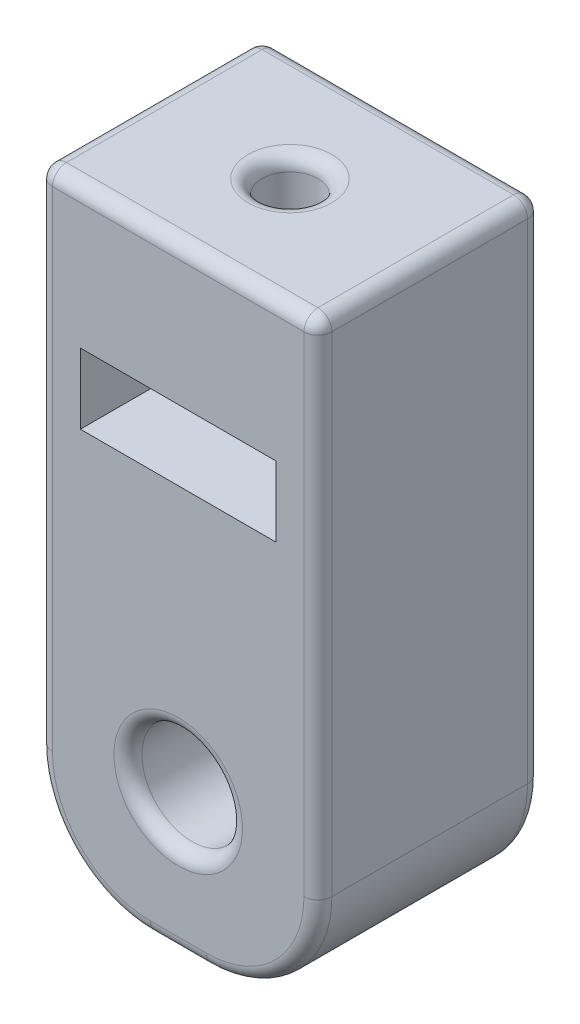
ISO-10303-21;
HEADER;
FILE_DESCRIPTION(('STEP AP214'),'2;1');
FILE_NAME('part.step','',(''),(''),'','','');
FILE_SCHEMA(('AUTOMOTIVE_DESIGN { 1 0 10303 214 1 1 1 1 }'));
ENDSEC;
DATA;
#1=APPLICATION_CONTEXT('core data for automotive mechanical design processes');
#2=APPLICATION_PROTOCOL_DEFINITION('international standard','automotive_design',2000,#1);
#3=PRODUCT_CONTEXT('',#1,'mechanical');
#4=PRODUCT('Part','Part','',(#3));
#5=PRODUCT_RELATED_PRODUCT_CATEGORY('part','',(#4));
#6=PRODUCT_DEFINITION_FORMATION('','',#4);
#7=PRODUCT_DEFINITION_CONTEXT('part definition',#1,'design');
#8=PRODUCT_DEFINITION('design','',#6,#7);
#9=PRODUCT_DEFINITION_SHAPE('','',#8);
#10=(LENGTH_UNIT() NAMED_UNIT(*) SI_UNIT(.MILLI.,.METRE.));
#11=(NAMED_UNIT(*) PLANE_ANGLE_UNIT() SI_UNIT($,.RADIAN.));
#12=(NAMED_UNIT(*) SI_UNIT($,.STERADIAN.) SOLID_ANGLE_UNIT());
#13=UNCERTAINTY_MEASURE_WITH_UNIT(LENGTH_MEASURE(1.E-05),#10,'distance_accuracy_value','');
#14=(GEOMETRIC_REPRESENTATION_CONTEXT(3) GLOBAL_UNCERTAINTY_ASSIGNED_CONTEXT((#13)) GLOBAL_UNIT_ASSIGNED_CONTEXT((#10,
#11,#12)) REPRESENTATION_CONTEXT('',''));
#15=CARTESIAN_POINT('',(0.,0.,0.));
#16=DIRECTION('',(0.,0.,1.));
#17=DIRECTION('',(1.,0.,0.));
#18=AXIS2_PLACEMENT_3D('',#15,#16,#17);
#19=CARTESIAN_POINT('',(6.35,12.7,5.08));
#20=DIRECTION('',(0.,1.,0.));
#21=DIRECTION('',(0.,0.,1.));
#22=AXIS2_PLACEMENT_3D('',#19,#20,#21);
#23=CYLINDRICAL_SURFACE('',#22,1.27);
#24=CARTESIAN_POINT('',(6.35,21.59,5.08));
#25=DIRECTION('',(0.,1.,0.));
#26=DIRECTION('',(0.,0.,1.));
#27=AXIS2_PLACEMENT_3D('',#24,#25,#26);
#28=CIRCLE('',#27,1.27);
#29=CARTESIAN_POINT('',(6.35,21.59,6.35));
#30=VERTEX_POINT('',#29);
#31=EDGE_CURVE('E43',#30,#30,#28,.F.);
#32=CARTESIAN_POINT('',(6.35,27.305,5.08));
#33=DIRECTION('',(0.,-1.,0.));
#34=DIRECTION('',(0.,0.,-1.));
#35=AXIS2_PLACEMENT_3D('',#32,#33,#34);
#36=CIRCLE('',#35,1.27);
#37=CARTESIAN_POINT('',(6.35,27.305,6.35));
#38=VERTEX_POINT('',#37);
#39=EDGE_CURVE('E279',#38,#38,#36,.F.);
#40=CARTESIAN_POINT('',(6.35,21.59,6.35));
#41=CARTESIAN_POINT('',(6.35,21.64953125,6.35));
#42=CARTESIAN_POINT('',(6.35,21.7090625,6.35));
#43=CARTESIAN_POINT('',(6.35,21.828125,6.35));
#44=CARTESIAN_POINT('',(6.35,21.88765625,6.35));
#45=CARTESIAN_POINT('',(6.35,22.00671875,6.35));
#46=CARTESIAN_POINT('',(6.35,22.06625,6.35));
#47=CARTESIAN_POINT('',(6.35,22.1853125,6.35));
#48=CARTESIAN_POINT('',(6.35,22.24484375,6.35));
#49=CARTESIAN_POINT('',(6.35,22.36390625,6.35));
#50=CARTESIAN_POINT('',(6.35,22.4234375,6.35));
#51=CARTESIAN_POINT('',(6.35,22.5425,6.35));
#52=CARTESIAN_POINT('',(6.35,22.60203125,6.35));
#53=CARTESIAN_POINT('',(6.35,22.72109375,6.35));
#54=CARTESIAN_POINT('',(6.35,22.780625,6.35));
#55=CARTESIAN_POINT('',(6.35,22.8996875,6.35));
#56=CARTESIAN_POINT('',(6.35,22.95921875,6.35));
#57=CARTESIAN_POINT('',(6.35,23.07828125,6.35));
#58=CARTESIAN_POINT('',(6.35,23.1378125,6.35));
#59=CARTESIAN_POINT('',(6.35,23.256875,6.35));
#60=CARTESIAN_POINT('',(6.35,23.31640625,6.35));
#61=CARTESIAN_POINT('',(6.35,23.43546875,6.35));
#62=CARTESIAN_POINT('',(6.35,23.495,6.35));
#63=CARTESIAN_POINT('',(6.35,23.6140625,6.35));
#64=CARTESIAN_POINT('',(6.35,23.67359375,6.35));
#65=CARTESIAN_POINT('',(6.35,23.79265625,6.35));
#66=CARTESIAN_POINT('',(6.35,23.8521875,6.35));
#67=CARTESIAN_POINT('',(6.35,23.97125,6.35));
#68=CARTESIAN_POINT('',(6.35,24.03078125,6.35));
#69=CARTESIAN_POINT('',(6.35,24.14984375,6.35));
#70=CARTESIAN_POINT('',(6.35,24.209375,6.35));
#71=CARTESIAN_POINT('',(6.35,24.3284375,6.35));
#72=CARTESIAN_POINT('',(6.35,24.38796875,6.35));
#73=CARTESIAN_POINT('',(6.35,24.50703125,6.35));
#74=CARTESIAN_POINT('',(6.35,24.5665625,6.35));
#75=CARTESIAN_POINT('',(6.35,24.685625,6.35));
#76=CARTESIAN_POINT('',(6.35,24.74515625,6.35));
#77=CARTESIAN_POINT('',(6.35,24.86421875,6.35));
#78=CARTESIAN_POINT('',(6.35,24.92375,6.35));
#79=CARTESIAN_POINT('',(6.35,25.0428125,6.35));
#80=CARTESIAN_POINT('',(6.35,25.10234375,6.35));
#81=CARTESIAN_POINT('',(6.35,25.22140625,6.35));
#82=CARTESIAN_POINT('',(6.35,25.2809375,6.35));
#83=CARTESIAN_POINT('',(6.35,25.4,6.35));
#84=CARTESIAN_POINT('',(6.35,25.45953125,6.35));
#85=CARTESIAN_POINT('',(6.35,25.57859375,6.35));
#86=CARTESIAN_POINT('',(6.35,25.638125,6.35));
#87=CARTESIAN_POINT('',(6.35,25.7571875,6.35));
#88=CARTESIAN_POINT('',(6.35,25.81671875,6.35));
#89=CARTESIAN_POINT('',(6.35,25.93578125,6.35));
#90=CARTESIAN_POINT('',(6.35,25.9953125,6.35));
#91=CARTESIAN_POINT('',(6.35,26.114375,6.35));
#92=CARTESIAN_POINT('',(6.35,26.17390625,6.35));
#93=CARTESIAN_POINT('',(6.35,26.29296875,6.35));
#94=CARTESIAN_POINT('',(6.35,26.3525,6.35));
#95=CARTESIAN_POINT('',(6.35,26.4715625,6.35));
#96=CARTESIAN_POINT('',(6.35,26.53109375,6.35));
#97=CARTESIAN_POINT('',(6.35,26.65015625,6.35));
#98=CARTESIAN_POINT('',(6.35,26.7096875,6.35));
#99=CARTESIAN_POINT('',(6.35,26.82875,6.35));
#100=CARTESIAN_POINT('',(6.35,26.88828125,6.35));
#101=CARTESIAN_POINT('',(6.35,27.00734375,6.35));
#102=CARTESIAN_POINT('',(6.35,27.066875,6.35));
#103=CARTESIAN_POINT('',(6.35,27.1859375,6.35));
#104=CARTESIAN_POINT('',(6.35,27.24546875,6.35));
#105=CARTESIAN_POINT('',(6.35,27.305,6.35));
#106=B_SPLINE_CURVE_WITH_KNOTS('',3,(#40,#41,#42,#43,#44,#45,#46,#47,#48,#49,#50,#51,#52,#53,
#54,#55,#56,#57,#58,#59,#60,#61,#62,#63,#64,#65,#66,#67,#68,#69,#70,#71,#72,#73,#74,#75,#76,#77,
#78,#79,#80,#81,#82,#83,#84,#85,#86,#87,#88,#89,#90,#91,#92,#93,#94,#95,#96,#97,#98,#99,#100,
#101,#102,#103,#104,#105),.UNSPECIFIED.,.F.,.F.,(4,2,2,2,2,2,2,2,2,2,2,2,2,2,2,2,2,2,2,2,2,2,2,
2,2,2,2,2,2,2,2,2,4),(0.,0.178593750000001,0.357187499999998,0.535781250000002,0.714375,
0.892968750000001,1.0715625,1.25015625,1.42875,1.60734375,1.7859375,1.96453125,2.143125,
2.32171875,2.5003125,2.67890625,2.8575,3.03609375,3.2146875,3.39328125,3.571875,3.75046875,
3.9290625,4.10765625,4.28625,4.46484375,4.6434375,4.82203125,5.000625,5.17921875,
5.35781250000001,5.53640625,5.71500000000001),.UNSPECIFIED.);
#107=EDGE_CURVE('BSEAM39',#30,#38,#106,.T.);
#108=ORIENTED_EDGE('',*,*,#31,.T.);
#109=ORIENTED_EDGE('',*,*,#39,.T.);
#110=ORIENTED_EDGE('',*,*,#107,.T.);
#111=ORIENTED_EDGE('',*,*,#107,.F.);
#112=EDGE_LOOP('',(#108,#110,#109,#111));
#113=FACE_BOUND('',#112,.T.);
#114=ADVANCED_FACE('F39',(#113),#23,.F.);
#115=CARTESIAN_POINT('',(0.,0.,10.16));
#116=DIRECTION('',(0.,0.,-1.));
#117=DIRECTION('',(-1.,0.,0.));
#118=AXIS2_PLACEMENT_3D('',#115,#116,#117);
#119=PLANE('',#118);
#120=DIRECTION('',(1.,0.,0.));
#121=VECTOR('',#120,1.);
#122=CARTESIAN_POINT('',(10.795,21.59,10.16));
#123=LINE('',#122,#121);
#124=CARTESIAN_POINT('',(1.905,21.59,10.16));
#125=VERTEX_POINT('',#124);
#126=CARTESIAN_POINT('',(10.795,21.59,10.16));
#127=VERTEX_POINT('',#126);
#128=EDGE_CURVE('E174',#125,#127,#123,.T.);
#129=ORIENTED_EDGE('',*,*,#128,.T.);
#130=DIRECTION('',(0.,-1.,0.));
#131=VECTOR('',#130,1.);
#132=CARTESIAN_POINT('',(10.795,21.59,10.16));
#133=LINE('',#132,#131);
#134=CARTESIAN_POINT('',(10.795,18.39468,10.16));
#135=VERTEX_POINT('',#134);
#136=EDGE_CURVE('E168',#127,#135,#133,.T.);
#137=ORIENTED_EDGE('',*,*,#136,.T.);
#138=DIRECTION('',(-1.,0.,0.));
#139=VECTOR('',#138,1.);
#140=CARTESIAN_POINT('',(10.795,18.39468,10.16));
#141=LINE('',#140,#139);
#142=CARTESIAN_POINT('',(1.905,18.39468,10.16));
#143=VERTEX_POINT('',#142);
#144=EDGE_CURVE('E177',#135,#143,#141,.T.);
#145=ORIENTED_EDGE('',*,*,#144,.T.);
#146=DIRECTION('',(0.,1.,0.));
#147=VECTOR('',#146,1.);
#148=CARTESIAN_POINT('',(1.905,21.59,10.16));
#149=LINE('',#148,#147);
#150=EDGE_CURVE('E56',#143,#125,#149,.T.);
#151=ORIENTED_EDGE('',*,*,#150,.T.);
#152=EDGE_LOOP('',(#129,#137,#145,#151));
#153=FACE_BOUND('',#152,.T.);
#154=CARTESIAN_POINT('',(6.35,6.35,10.16));
#155=DIRECTION('',(0.,0.,-1.));
#156=DIRECTION('',(-1.,0.,0.));
#157=AXIS2_PLACEMENT_3D('',#154,#155,#156);
#158=CIRCLE('',#157,2.921);
#159=CARTESIAN_POINT('',(3.429,6.35,10.16));
#160=VERTEX_POINT('',#159);
#161=EDGE_CURVE('E11',#160,#160,#158,.T.);
#162=ORIENTED_EDGE('',*,*,#161,.T.);
#163=EDGE_LOOP('',(#162));
#164=FACE_BOUND('',#163,.T.);
#165=DIRECTION('',(0.,-1.,0.));
#166=VECTOR('',#165,1.);
#167=CARTESIAN_POINT('',(0.635,0.,10.16));
#168=LINE('',#167,#166);
#169=CARTESIAN_POINT('',(0.635,27.305,10.16));
#170=VERTEX_POINT('',#169);
#171=CARTESIAN_POINT('',(0.635,5.08,10.16));
#172=VERTEX_POINT('',#171);
#173=EDGE_CURVE('E290',#170,#172,#168,.T.);
#174=ORIENTED_EDGE('',*,*,#173,.T.);
#175=CARTESIAN_POINT('',(5.08,5.08,10.16));
#176=DIRECTION('',(0.,0.,-1.));
#177=DIRECTION('',(-1.,0.,0.));
#178=AXIS2_PLACEMENT_3D('',#175,#176,#177);
#179=CIRCLE('',#178,4.445);
#180=CARTESIAN_POINT('',(5.08,0.635,10.16));
#181=VERTEX_POINT('',#180);
#182=EDGE_CURVE('E48',#172,#181,#179,.F.);
#183=ORIENTED_EDGE('',*,*,#182,.T.);
#184=DIRECTION('',(1.,0.,0.));
#185=VECTOR('',#184,1.);
#186=CARTESIAN_POINT('',(0.,0.635,10.16));
#187=LINE('',#186,#185);
#188=CARTESIAN_POINT('',(7.62,0.635,10.16));
#189=VERTEX_POINT('',#188);
#190=EDGE_CURVE('E282',#181,#189,#187,.T.);
#191=ORIENTED_EDGE('',*,*,#190,.T.);
#192=CARTESIAN_POINT('',(7.62,5.08,10.16));
#193=DIRECTION('',(0.,0.,-1.));
#194=DIRECTION('',(-1.,0.,0.));
#195=AXIS2_PLACEMENT_3D('',#192,#193,#194);
#196=CIRCLE('',#195,4.445);
#197=CARTESIAN_POINT('',(12.065,5.08,10.16));
#198=VERTEX_POINT('',#197);
#199=EDGE_CURVE('E284',#189,#198,#196,.F.);
#200=ORIENTED_EDGE('',*,*,#199,.T.);
#201=DIRECTION('',(0.,1.,0.));
#202=VECTOR('',#201,1.);
#203=CARTESIAN_POINT('',(12.065,0.,10.16));
#204=LINE('',#203,#202);
#205=CARTESIAN_POINT('',(12.065,27.305,10.16));
#206=VERTEX_POINT('',#205);
#207=EDGE_CURVE('E286',#198,#206,#204,.T.);
#208=ORIENTED_EDGE('',*,*,#207,.T.);
#209=DIRECTION('',(-1.,0.,0.));
#210=VECTOR('',#209,1.);
#211=CARTESIAN_POINT('',(0.,27.305,10.16));
#212=LINE('',#211,#210);
#213=EDGE_CURVE('E288',#206,#170,#212,.T.);
#214=ORIENTED_EDGE('',*,*,#213,.T.);
#215=EDGE_LOOP('',(#174,#183,#191,#200,#208,#214));
#216=FACE_BOUND('',#215,.T.);
#217=ADVANCED_FACE('F182',(#153,#164,#216),#119,.F.);
#218=CARTESIAN_POINT('',(0.,0.,0.));
#219=DIRECTION('',(0.,0.,-1.));
#220=DIRECTION('',(-1.,0.,0.));
#221=AXIS2_PLACEMENT_3D('',#218,#219,#220);
#222=PLANE('',#221);
#223=DIRECTION('',(0.,-1.,0.));
#224=VECTOR('',#223,1.);
#225=CARTESIAN_POINT('',(10.795,21.59,0.));
#226=LINE('',#225,#224);
#227=CARTESIAN_POINT('',(10.795,21.59,0.));
#228=VERTEX_POINT('',#227);
#229=CARTESIAN_POINT('',(10.795,18.39468,0.));
#230=VERTEX_POINT('',#229);
#231=EDGE_CURVE('E64',#228,#230,#226,.T.);
#232=ORIENTED_EDGE('',*,*,#231,.F.);
#233=DIRECTION('',(1.,0.,0.));
#234=VECTOR('',#233,1.);
#235=CARTESIAN_POINT('',(10.795,21.59,0.));
#236=LINE('',#235,#234);
#237=CARTESIAN_POINT('',(1.905,21.59,0.));
#238=VERTEX_POINT('',#237);
#239=EDGE_CURVE('E185',#238,#228,#236,.T.);
#240=ORIENTED_EDGE('',*,*,#239,.F.);
#241=DIRECTION('',(0.,1.,0.));
#242=VECTOR('',#241,1.);
#243=CARTESIAN_POINT('',(1.905,21.59,0.));
#244=LINE('',#243,#242);
#245=CARTESIAN_POINT('',(1.905,18.39468,0.));
#246=VERTEX_POINT('',#245);
#247=EDGE_CURVE('E188',#246,#238,#244,.T.);
#248=ORIENTED_EDGE('',*,*,#247,.F.);
#249=DIRECTION('',(-1.,0.,0.));
#250=VECTOR('',#249,1.);
#251=CARTESIAN_POINT('',(10.795,18.39468,0.));
#252=LINE('',#251,#250);
#253=EDGE_CURVE('E194',#230,#246,#252,.T.);
#254=ORIENTED_EDGE('',*,*,#253,.F.);
#255=EDGE_LOOP('',(#232,#240,#248,#254));
#256=FACE_BOUND('',#255,.T.);
#257=CARTESIAN_POINT('',(6.35,6.35,0.));
#258=DIRECTION('',(0.,0.,-1.));
#259=DIRECTION('',(-1.,0.,0.));
#260=AXIS2_PLACEMENT_3D('',#257,#258,#259);
#261=CIRCLE('',#260,2.921);
#262=CARTESIAN_POINT('',(3.429,6.35,0.));
#263=VERTEX_POINT('',#262);
#264=EDGE_CURVE('E233',#263,#263,#261,.F.);
#265=ORIENTED_EDGE('',*,*,#264,.T.);
#266=EDGE_LOOP('',(#265));
#267=FACE_BOUND('',#266,.T.);
#268=CARTESIAN_POINT('',(5.08,5.08,0.));
#269=DIRECTION('',(0.,0.,-1.));
#270=DIRECTION('',(-1.,0.,0.));
#271=AXIS2_PLACEMENT_3D('',#268,#269,#270);
#272=CIRCLE('',#271,4.445);
#273=CARTESIAN_POINT('',(5.08,0.635,0.));
#274=VERTEX_POINT('',#273);
#275=CARTESIAN_POINT('',(0.635,5.08,0.));
#276=VERTEX_POINT('',#275);
#277=EDGE_CURVE('E228',#274,#276,#272,.T.);
#278=ORIENTED_EDGE('',*,*,#277,.T.);
#279=DIRECTION('',(0.,-1.,0.));
#280=VECTOR('',#279,1.);
#281=CARTESIAN_POINT('',(0.635,27.94,0.));
#282=LINE('',#281,#280);
#283=CARTESIAN_POINT('',(0.635,27.305,0.));
#284=VERTEX_POINT('',#283);
#285=EDGE_CURVE('E230',#276,#284,#282,.F.);
#286=ORIENTED_EDGE('',*,*,#285,.T.);
#287=DIRECTION('',(-1.,0.,0.));
#288=VECTOR('',#287,1.);
#289=CARTESIAN_POINT('',(12.7,27.305,0.));
#290=LINE('',#289,#288);
#291=CARTESIAN_POINT('',(12.065,27.305,0.));
#292=VERTEX_POINT('',#291);
#293=EDGE_CURVE('E220',#284,#292,#290,.F.);
#294=ORIENTED_EDGE('',*,*,#293,.T.);
#295=DIRECTION('',(0.,1.,0.));
#296=VECTOR('',#295,1.);
#297=CARTESIAN_POINT('',(12.065,5.08,0.));
#298=LINE('',#297,#296);
#299=CARTESIAN_POINT('',(12.065,5.08,0.));
#300=VERTEX_POINT('',#299);
#301=EDGE_CURVE('E222',#292,#300,#298,.F.);
#302=ORIENTED_EDGE('',*,*,#301,.T.);
#303=CARTESIAN_POINT('',(7.62,5.08,0.));
#304=DIRECTION('',(0.,0.,-1.));
#305=DIRECTION('',(-1.,0.,0.));
#306=AXIS2_PLACEMENT_3D('',#303,#304,#305);
#307=CIRCLE('',#306,4.445);
#308=CARTESIAN_POINT('',(7.62,0.635,0.));
#309=VERTEX_POINT('',#308);
#310=EDGE_CURVE('E224',#300,#309,#307,.T.);
#311=ORIENTED_EDGE('',*,*,#310,.T.);
#312=DIRECTION('',(1.,0.,0.));
#313=VECTOR('',#312,1.);
#314=CARTESIAN_POINT('',(5.08,0.635,0.));
#315=LINE('',#314,#313);
#316=EDGE_CURVE('E226',#309,#274,#315,.F.);
#317=ORIENTED_EDGE('',*,*,#316,.T.);
#318=EDGE_LOOP('',(#278,#286,#294,#302,#311,#317));
#319=FACE_BOUND('',#318,.T.);
#320=ADVANCED_FACE('F375',(#256,#267,#319),#222,.T.);
#321=CARTESIAN_POINT('',(0.,0.,10.16));
#322=DIRECTION('',(1.,0.,0.));
#323=DIRECTION('',(0.,0.,-1.));
#324=AXIS2_PLACEMENT_3D('',#321,#322,#323);
#325=PLANE('',#324);
#326=DIRECTION('',(0.,0.,-1.));
#327=VECTOR('',#326,1.);
#328=CARTESIAN_POINT('',(0.,27.305,10.16));
#329=LINE('',#328,#327);
#330=CARTESIAN_POINT('',(0.,27.305,9.525));
#331=VERTEX_POINT('',#330);
#332=CARTESIAN_POINT('',(0.,27.305,0.635));
#333=VERTEX_POINT('',#332);
#334=EDGE_CURVE('E244',#331,#333,#329,.T.);
#335=ORIENTED_EDGE('',*,*,#334,.T.);
#336=DIRECTION('',(0.,-1.,0.));
#337=VECTOR('',#336,1.);
#338=CARTESIAN_POINT('',(0.,5.08,0.635));
#339=LINE('',#338,#337);
#340=CARTESIAN_POINT('',(0.,5.08,0.635));
#341=VERTEX_POINT('',#340);
#342=EDGE_CURVE('E246',#333,#341,#339,.T.);
#343=ORIENTED_EDGE('',*,*,#342,.T.);
#344=DIRECTION('',(0.,0.,-1.));
#345=VECTOR('',#344,1.);
#346=CARTESIAN_POINT('',(0.,5.08,10.16));
#347=LINE('',#346,#345);
#348=CARTESIAN_POINT('',(0.,5.08,9.525));
#349=VERTEX_POINT('',#348);
#350=EDGE_CURVE('E217',#341,#349,#347,.F.);
#351=ORIENTED_EDGE('',*,*,#350,.T.);
#352=DIRECTION('',(0.,-1.,0.));
#353=VECTOR('',#352,1.);
#354=CARTESIAN_POINT('',(0.,0.,9.525));
#355=LINE('',#354,#353);
#356=EDGE_CURVE('E242',#349,#331,#355,.F.);
#357=ORIENTED_EDGE('',*,*,#356,.T.);
#358=EDGE_LOOP('',(#335,#343,#351,#357));
#359=FACE_BOUND('',#358,.T.);
#360=ADVANCED_FACE('F700',(#359),#325,.F.);
#361=CARTESIAN_POINT('',(0.,0.,10.16));
#362=DIRECTION('',(0.,1.,0.));
#363=DIRECTION('',(0.,0.,1.));
#364=AXIS2_PLACEMENT_3D('',#361,#362,#363);
#365=PLANE('',#364);
#366=DIRECTION('',(0.,0.,-1.));
#367=VECTOR('',#366,1.);
#368=CARTESIAN_POINT('',(5.08,0.,10.16));
#369=LINE('',#368,#367);
#370=CARTESIAN_POINT('',(5.08,0.,9.525));
#371=VERTEX_POINT('',#370);
#372=CARTESIAN_POINT('',(5.08,0.,0.635));
#373=VERTEX_POINT('',#372);
#374=EDGE_CURVE('E211',#371,#373,#369,.T.);
#375=ORIENTED_EDGE('',*,*,#374,.T.);
#376=DIRECTION('',(1.,0.,0.));
#377=VECTOR('',#376,1.);
#378=CARTESIAN_POINT('',(7.62,0.,0.635));
#379=LINE('',#378,#377);
#380=CARTESIAN_POINT('',(7.62,0.,0.635));
#381=VERTEX_POINT('',#380);
#382=EDGE_CURVE('E255',#373,#381,#379,.T.);
#383=ORIENTED_EDGE('',*,*,#382,.T.);
#384=DIRECTION('',(0.,0.,-1.));
#385=VECTOR('',#384,1.);
#386=CARTESIAN_POINT('',(7.62,0.,10.16));
#387=LINE('',#386,#385);
#388=CARTESIAN_POINT('',(7.62,0.,9.525));
#389=VERTEX_POINT('',#388);
#390=EDGE_CURVE('E214',#381,#389,#387,.F.);
#391=ORIENTED_EDGE('',*,*,#390,.T.);
#392=DIRECTION('',(1.,0.,0.));
#393=VECTOR('',#392,1.);
#394=CARTESIAN_POINT('',(0.,0.,9.525));
#395=LINE('',#394,#393);
#396=EDGE_CURVE('E253',#389,#371,#395,.F.);
#397=ORIENTED_EDGE('',*,*,#396,.T.);
#398=EDGE_LOOP('',(#375,#383,#391,#397));
#399=FACE_BOUND('',#398,.T.);
#400=ADVANCED_FACE('F721',(#399),#365,.F.);
#401=CARTESIAN_POINT('',(12.7,0.,10.16));
#402=DIRECTION('',(-1.,0.,0.));
#403=DIRECTION('',(0.,0.,1.));
#404=AXIS2_PLACEMENT_3D('',#401,#402,#403);
#405=PLANE('',#404);
#406=DIRECTION('',(0.,0.,-1.));
#407=VECTOR('',#406,1.);
#408=CARTESIAN_POINT('',(12.7,5.08,10.16));
#409=LINE('',#408,#407);
#410=CARTESIAN_POINT('',(12.7,5.08,9.525));
#411=VERTEX_POINT('',#410);
#412=CARTESIAN_POINT('',(12.7,5.08,0.635));
#413=VERTEX_POINT('',#412);
#414=EDGE_CURVE('E207',#411,#413,#409,.T.);
#415=ORIENTED_EDGE('',*,*,#414,.T.);
#416=DIRECTION('',(0.,1.,0.));
#417=VECTOR('',#416,1.);
#418=CARTESIAN_POINT('',(12.7,27.94,0.635));
#419=LINE('',#418,#417);
#420=CARTESIAN_POINT('',(12.7,27.305,0.635));
#421=VERTEX_POINT('',#420);
#422=EDGE_CURVE('E265',#413,#421,#419,.T.);
#423=ORIENTED_EDGE('',*,*,#422,.T.);
#424=DIRECTION('',(0.,0.,-1.));
#425=VECTOR('',#424,1.);
#426=CARTESIAN_POINT('',(12.7,27.305,10.16));
#427=LINE('',#426,#425);
#428=CARTESIAN_POINT('',(12.7,27.305,9.525));
#429=VERTEX_POINT('',#428);
#430=EDGE_CURVE('E263',#421,#429,#427,.F.);
#431=ORIENTED_EDGE('',*,*,#430,.T.);
#432=DIRECTION('',(0.,1.,0.));
#433=VECTOR('',#432,1.);
#434=CARTESIAN_POINT('',(12.7,0.,9.525));
#435=LINE('',#434,#433);
#436=EDGE_CURVE('E261',#429,#411,#435,.F.);
#437=ORIENTED_EDGE('',*,*,#436,.T.);
#438=EDGE_LOOP('',(#415,#423,#431,#437));
#439=FACE_BOUND('',#438,.T.);
#440=ADVANCED_FACE('F730',(#439),#405,.F.);
#441=CARTESIAN_POINT('',(0.,27.94,10.16));
#442=DIRECTION('',(0.,-1.,0.));
#443=DIRECTION('',(0.,0.,-1.));
#444=AXIS2_PLACEMENT_3D('',#441,#442,#443);
#445=PLANE('',#444);
#446=CARTESIAN_POINT('',(6.35,27.94,5.08));
#447=DIRECTION('',(0.,-1.,0.));
#448=DIRECTION('',(0.,0.,-1.));
#449=AXIS2_PLACEMENT_3D('',#446,#447,#448);
#450=CIRCLE('',#449,1.905);
#451=CARTESIAN_POINT('',(6.35,27.94,3.175));
#452=VERTEX_POINT('',#451);
#453=EDGE_CURVE('E276',#452,#452,#450,.T.);
#454=ORIENTED_EDGE('',*,*,#453,.T.);
#455=EDGE_LOOP('',(#454));
#456=FACE_BOUND('',#455,.T.);
#457=DIRECTION('',(0.,0.,-1.));
#458=VECTOR('',#457,1.);
#459=CARTESIAN_POINT('',(12.065,27.94,10.16));
#460=LINE('',#459,#458);
#461=CARTESIAN_POINT('',(12.065,27.94,9.525));
#462=VERTEX_POINT('',#461);
#463=CARTESIAN_POINT('',(12.065,27.94,0.635));
#464=VERTEX_POINT('',#463);
#465=EDGE_CURVE('E271',#462,#464,#460,.T.);
#466=ORIENTED_EDGE('',*,*,#465,.T.);
#467=DIRECTION('',(-1.,0.,0.));
#468=VECTOR('',#467,1.);
#469=CARTESIAN_POINT('',(0.,27.94,0.635));
#470=LINE('',#469,#468);
#471=CARTESIAN_POINT('',(0.635,27.94,0.635));
#472=VERTEX_POINT('',#471);
#473=EDGE_CURVE('E274',#464,#472,#470,.T.);
#474=ORIENTED_EDGE('',*,*,#473,.T.);
#475=DIRECTION('',(0.,0.,-1.));
#476=VECTOR('',#475,1.);
#477=CARTESIAN_POINT('',(0.635,27.94,10.16));
#478=LINE('',#477,#476);
#479=CARTESIAN_POINT('',(0.635,27.94,9.525));
#480=VERTEX_POINT('',#479);
#481=EDGE_CURVE('E269',#472,#480,#478,.F.);
#482=ORIENTED_EDGE('',*,*,#481,.T.);
#483=DIRECTION('',(-1.,0.,0.));
#484=VECTOR('',#483,1.);
#485=CARTESIAN_POINT('',(0.,27.94,9.525));
#486=LINE('',#485,#484);
#487=EDGE_CURVE('E267',#480,#462,#486,.F.);
#488=ORIENTED_EDGE('',*,*,#487,.T.);
#489=EDGE_LOOP('',(#466,#474,#482,#488));
#490=FACE_BOUND('',#489,.T.);
#491=ADVANCED_FACE('F740',(#456,#490),#445,.F.);
#492=CARTESIAN_POINT('',(6.35,6.35,10.16));
#493=DIRECTION('',(0.,0.,-1.));
#494=DIRECTION('',(-1.,0.,0.));
#495=AXIS2_PLACEMENT_3D('',#492,#493,#494);
#496=CYLINDRICAL_SURFACE('',#495,2.286);
#497=CARTESIAN_POINT('',(6.35,6.35,0.635));
#498=DIRECTION('',(0.,0.,-1.));
#499=DIRECTION('',(-1.,0.,0.));
#500=AXIS2_PLACEMENT_3D('',#497,#498,#499);
#501=CIRCLE('',#500,2.286);
#502=CARTESIAN_POINT('',(4.064,6.35,0.635));
#503=VERTEX_POINT('',#502);
#504=EDGE_CURVE('E239',#503,#503,#501,.T.);
#505=ORIENTED_EDGE('',*,*,#504,.T.);
#506=EDGE_LOOP('',(#505));
#507=FACE_BOUND('',#506,.T.);
#508=CARTESIAN_POINT('',(6.35,6.35,9.525));
#509=DIRECTION('',(0.,0.,-1.));
#510=DIRECTION('',(-1.,0.,0.));
#511=AXIS2_PLACEMENT_3D('',#508,#509,#510);
#512=CIRCLE('',#511,2.286);
#513=CARTESIAN_POINT('',(4.064,6.35,9.525));
#514=VERTEX_POINT('',#513);
#515=EDGE_CURVE('E236',#514,#514,#512,.F.);
#516=ORIENTED_EDGE('',*,*,#515,.T.);
#517=EDGE_LOOP('',(#516));
#518=FACE_BOUND('',#517,.T.);
#519=ADVANCED_FACE('F416',(#507,#518),#496,.F.);
#520=CARTESIAN_POINT('',(7.62,5.08,10.16));
#521=DIRECTION('',(0.,0.,-1.));
#522=DIRECTION('',(-1.,0.,0.));
#523=AXIS2_PLACEMENT_3D('',#520,#521,#522);
#524=CYLINDRICAL_SURFACE('',#523,5.08);
#525=ORIENTED_EDGE('',*,*,#390,.F.);
#526=CARTESIAN_POINT('',(7.62,5.08,0.635));
#527=DIRECTION('',(0.,0.,-1.));
#528=DIRECTION('',(-1.,0.,0.));
#529=AXIS2_PLACEMENT_3D('',#526,#527,#528);
#530=CIRCLE('',#529,5.08);
#531=EDGE_CURVE('E259',#381,#413,#530,.F.);
#532=ORIENTED_EDGE('',*,*,#531,.T.);
#533=ORIENTED_EDGE('',*,*,#414,.F.);
#534=CARTESIAN_POINT('',(7.62,5.08,9.525));
#535=DIRECTION('',(0.,0.,-1.));
#536=DIRECTION('',(-1.,0.,0.));
#537=AXIS2_PLACEMENT_3D('',#534,#535,#536);
#538=CIRCLE('',#537,5.08);
#539=EDGE_CURVE('E257',#411,#389,#538,.T.);
#540=ORIENTED_EDGE('',*,*,#539,.T.);
#541=EDGE_LOOP('',(#525,#532,#533,#540));
#542=FACE_BOUND('',#541,.T.);
#543=ADVANCED_FACE('F428',(#542),#524,.T.);
#544=CARTESIAN_POINT('',(5.08,5.08,10.16));
#545=DIRECTION('',(0.,0.,-1.));
#546=DIRECTION('',(-1.,0.,0.));
#547=AXIS2_PLACEMENT_3D('',#544,#545,#546);
#548=CYLINDRICAL_SURFACE('',#547,5.08);
#549=ORIENTED_EDGE('',*,*,#350,.F.);
#550=CARTESIAN_POINT('',(5.08,5.08,0.635));
#551=DIRECTION('',(0.,0.,-1.));
#552=DIRECTION('',(-1.,0.,0.));
#553=AXIS2_PLACEMENT_3D('',#550,#551,#552);
#554=CIRCLE('',#553,5.08);
#555=EDGE_CURVE('E251',#341,#373,#554,.F.);
#556=ORIENTED_EDGE('',*,*,#555,.T.);
#557=ORIENTED_EDGE('',*,*,#374,.F.);
#558=CARTESIAN_POINT('',(5.08,5.08,9.525));
#559=DIRECTION('',(0.,0.,-1.));
#560=DIRECTION('',(-1.,0.,0.));
#561=AXIS2_PLACEMENT_3D('',#558,#559,#560);
#562=CIRCLE('',#561,5.08);
#563=EDGE_CURVE('E249',#371,#349,#562,.T.);
#564=ORIENTED_EDGE('',*,*,#563,.T.);
#565=EDGE_LOOP('',(#549,#556,#557,#564));
#566=FACE_BOUND('',#565,.T.);
#567=ADVANCED_FACE('F434',(#566),#548,.T.);
#568=CARTESIAN_POINT('',(6.35,6.35,0.635));
#569=DIRECTION('',(0.,0.,-1.));
#570=DIRECTION('',(-1.,0.,0.));
#571=AXIS2_PLACEMENT_3D('',#568,#569,#570);
#572=TOROIDAL_SURFACE('',#571,2.921,0.635);
#573=ORIENTED_EDGE('',*,*,#504,.F.);
#574=EDGE_LOOP('',(#573));
#575=FACE_BOUND('',#574,.T.);
#576=ORIENTED_EDGE('',*,*,#264,.F.);
#577=EDGE_LOOP('',(#576));
#578=FACE_BOUND('',#577,.T.);
#579=ADVANCED_FACE('F445',(#575,#578),#572,.T.);
#580=CARTESIAN_POINT('',(7.62,5.08,9.525));
#581=DIRECTION('',(0.,0.,-1.));
#582=DIRECTION('',(-1.,0.,0.));
#583=AXIS2_PLACEMENT_3D('',#580,#581,#582);
#584=TOROIDAL_SURFACE('',#583,4.445,0.635);
#585=CARTESIAN_POINT('',(7.62,0.635,9.525));
#586=DIRECTION('',(-1.,0.,0.));
#587=DIRECTION('',(0.,0.,1.));
#588=AXIS2_PLACEMENT_3D('',#585,#586,#587);
#589=CIRCLE('',#588,0.635);
#590=EDGE_CURVE('E345',#389,#189,#589,.T.);
#591=ORIENTED_EDGE('',*,*,#590,.F.);
#592=ORIENTED_EDGE('',*,*,#539,.F.);
#593=CARTESIAN_POINT('',(12.065,5.08,9.525));
#594=DIRECTION('',(0.,1.,0.));
#595=DIRECTION('',(0.,0.,1.));
#596=AXIS2_PLACEMENT_3D('',#593,#594,#595);
#597=CIRCLE('',#596,0.635);
#598=EDGE_CURVE('E208',#198,#411,#597,.T.);
#599=ORIENTED_EDGE('',*,*,#598,.F.);
#600=ORIENTED_EDGE('',*,*,#199,.F.);
#601=EDGE_LOOP('',(#591,#592,#599,#600));
#602=FACE_BOUND('',#601,.T.);
#603=ADVANCED_FACE('F456',(#602),#584,.T.);
#604=CARTESIAN_POINT('',(12.065,0.,9.525));
#605=DIRECTION('',(0.,1.,0.));
#606=DIRECTION('',(0.,0.,1.));
#607=AXIS2_PLACEMENT_3D('',#604,#605,#606);
#608=CYLINDRICAL_SURFACE('',#607,0.635);
#609=ORIENTED_EDGE('',*,*,#598,.T.);
#610=ORIENTED_EDGE('',*,*,#436,.F.);
#611=CARTESIAN_POINT('',(12.065,27.305,9.525));
#612=DIRECTION('',(0.,1.,0.));
#613=DIRECTION('',(0.,0.,1.));
#614=AXIS2_PLACEMENT_3D('',#611,#612,#613);
#615=CIRCLE('',#614,0.635);
#616=EDGE_CURVE('E342',#206,#429,#615,.T.);
#617=ORIENTED_EDGE('',*,*,#616,.F.);
#618=ORIENTED_EDGE('',*,*,#207,.F.);
#619=EDGE_LOOP('',(#609,#610,#617,#618));
#620=FACE_BOUND('',#619,.T.);
#621=ADVANCED_FACE('F467',(#620),#608,.T.);
#622=CARTESIAN_POINT('',(0.,0.635,9.525));
#623=DIRECTION('',(1.,0.,0.));
#624=DIRECTION('',(0.,0.,-1.));
#625=AXIS2_PLACEMENT_3D('',#622,#623,#624);
#626=CYLINDRICAL_SURFACE('',#625,0.635);
#627=ORIENTED_EDGE('',*,*,#590,.T.);
#628=ORIENTED_EDGE('',*,*,#190,.F.);
#629=CARTESIAN_POINT('',(5.08,0.635,9.525));
#630=DIRECTION('',(-1.,0.,0.));
#631=DIRECTION('',(0.,0.,1.));
#632=AXIS2_PLACEMENT_3D('',#629,#630,#631);
#633=CIRCLE('',#632,0.635);
#634=EDGE_CURVE('E340',#371,#181,#633,.T.);
#635=ORIENTED_EDGE('',*,*,#634,.F.);
#636=ORIENTED_EDGE('',*,*,#396,.F.);
#637=EDGE_LOOP('',(#627,#628,#635,#636));
#638=FACE_BOUND('',#637,.T.);
#639=ADVANCED_FACE('F478',(#638),#626,.T.);
#640=CARTESIAN_POINT('',(12.065,27.305,9.525));
#641=DIRECTION('',(1.,0.,0.));
#642=DIRECTION('',(0.,0.,-1.));
#643=AXIS2_PLACEMENT_3D('',#640,#641,#642);
#644=SPHERICAL_SURFACE('',#643,0.635);
#645=CARTESIAN_POINT('',(12.065,27.305,9.525));
#646=DIRECTION('',(1.,0.,0.));
#647=DIRECTION('',(0.,0.,-1.));
#648=AXIS2_PLACEMENT_3D('',#645,#646,#647);
#649=CIRCLE('',#648,0.635);
#650=EDGE_CURVE('E334',#206,#462,#649,.F.);
#651=ORIENTED_EDGE('',*,*,#650,.F.);
#652=ORIENTED_EDGE('',*,*,#616,.T.);
#653=CARTESIAN_POINT('',(12.065,27.305,9.525));
#654=DIRECTION('',(0.,0.,1.));
#655=DIRECTION('',(1.,0.,0.));
#656=AXIS2_PLACEMENT_3D('',#653,#654,#655);
#657=CIRCLE('',#656,0.635);
#658=EDGE_CURVE('E337',#462,#429,#657,.F.);
#659=ORIENTED_EDGE('',*,*,#658,.F.);
#660=EDGE_LOOP('',(#651,#652,#659));
#661=FACE_BOUND('',#660,.T.);
#662=ADVANCED_FACE('F489',(#661),#644,.T.);
#663=CARTESIAN_POINT('',(5.08,5.08,9.525));
#664=DIRECTION('',(0.,0.,-1.));
#665=DIRECTION('',(-1.,0.,0.));
#666=AXIS2_PLACEMENT_3D('',#663,#664,#665);
#667=TOROIDAL_SURFACE('',#666,4.445,0.635);
#668=ORIENTED_EDGE('',*,*,#634,.T.);
#669=ORIENTED_EDGE('',*,*,#182,.F.);
#670=CARTESIAN_POINT('',(0.635,5.08,9.525));
#671=DIRECTION('',(0.,1.,0.));
#672=DIRECTION('',(0.,0.,1.));
#673=AXIS2_PLACEMENT_3D('',#670,#671,#672);
#674=CIRCLE('',#673,0.635);
#675=EDGE_CURVE('E331',#349,#172,#674,.T.);
#676=ORIENTED_EDGE('',*,*,#675,.F.);
#677=ORIENTED_EDGE('',*,*,#563,.F.);
#678=EDGE_LOOP('',(#668,#669,#676,#677));
#679=FACE_BOUND('',#678,.T.);
#680=ADVANCED_FACE('F500',(#679),#667,.T.);
#681=CARTESIAN_POINT('',(12.065,27.305,10.16));
#682=DIRECTION('',(0.,0.,-1.));
#683=DIRECTION('',(-1.,0.,0.));
#684=AXIS2_PLACEMENT_3D('',#681,#682,#683);
#685=CYLINDRICAL_SURFACE('',#684,0.635);
#686=ORIENTED_EDGE('',*,*,#658,.T.);
#687=ORIENTED_EDGE('',*,*,#430,.F.);
#688=CARTESIAN_POINT('',(12.065,27.305,0.635));
#689=DIRECTION('',(0.,0.,-1.));
#690=DIRECTION('',(-1.,0.,0.));
#691=AXIS2_PLACEMENT_3D('',#688,#689,#690);
#692=CIRCLE('',#691,0.635);
#693=EDGE_CURVE('E325',#464,#421,#692,.T.);
#694=ORIENTED_EDGE('',*,*,#693,.F.);
#695=ORIENTED_EDGE('',*,*,#465,.F.);
#696=EDGE_LOOP('',(#686,#687,#694,#695));
#697=FACE_BOUND('',#696,.T.);
#698=ADVANCED_FACE('F511',(#697),#685,.T.);
#699=CARTESIAN_POINT('',(0.,27.305,9.525));
#700=DIRECTION('',(-1.,0.,0.));
#701=DIRECTION('',(0.,0.,1.));
#702=AXIS2_PLACEMENT_3D('',#699,#700,#701);
#703=CYLINDRICAL_SURFACE('',#702,0.635);
#704=ORIENTED_EDGE('',*,*,#650,.T.);
#705=ORIENTED_EDGE('',*,*,#487,.F.);
#706=CARTESIAN_POINT('',(0.635,27.305,9.525));
#707=DIRECTION('',(-1.,0.,0.));
#708=DIRECTION('',(0.,0.,1.));
#709=AXIS2_PLACEMENT_3D('',#706,#707,#708);
#710=CIRCLE('',#709,0.635);
#711=EDGE_CURVE('E322',#170,#480,#710,.T.);
#712=ORIENTED_EDGE('',*,*,#711,.F.);
#713=ORIENTED_EDGE('',*,*,#213,.F.);
#714=EDGE_LOOP('',(#704,#705,#712,#713));
#715=FACE_BOUND('',#714,.T.);
#716=ADVANCED_FACE('F522',(#715),#703,.T.);
#717=CARTESIAN_POINT('',(0.635,0.,9.525));
#718=DIRECTION('',(0.,-1.,0.));
#719=DIRECTION('',(0.,0.,-1.));
#720=AXIS2_PLACEMENT_3D('',#717,#718,#719);
#721=CYLINDRICAL_SURFACE('',#720,0.635);
#722=ORIENTED_EDGE('',*,*,#675,.T.);
#723=ORIENTED_EDGE('',*,*,#173,.F.);
#724=CARTESIAN_POINT('',(0.635,27.305,9.525));
#725=DIRECTION('',(0.,1.,0.));
#726=DIRECTION('',(0.,0.,1.));
#727=AXIS2_PLACEMENT_3D('',#724,#725,#726);
#728=CIRCLE('',#727,0.635);
#729=EDGE_CURVE('E319',#331,#170,#728,.T.);
#730=ORIENTED_EDGE('',*,*,#729,.F.);
#731=ORIENTED_EDGE('',*,*,#356,.F.);
#732=EDGE_LOOP('',(#722,#723,#730,#731));
#733=FACE_BOUND('',#732,.T.);
#734=ADVANCED_FACE('F533',(#733),#721,.T.);
#735=CARTESIAN_POINT('',(12.065,0.,0.635));
#736=DIRECTION('',(0.,-1.,0.));
#737=DIRECTION('',(0.,0.,-1.));
#738=AXIS2_PLACEMENT_3D('',#735,#736,#737);
#739=CYLINDRICAL_SURFACE('',#738,0.635);
#740=CARTESIAN_POINT('',(12.065,27.305,0.635));
#741=DIRECTION('',(0.,1.,0.));
#742=DIRECTION('',(0.,0.,1.));
#743=AXIS2_PLACEMENT_3D('',#740,#741,#742);
#744=CIRCLE('',#743,0.635);
#745=EDGE_CURVE('E328',#421,#292,#744,.T.);
#746=ORIENTED_EDGE('',*,*,#745,.F.);
#747=ORIENTED_EDGE('',*,*,#422,.F.);
#748=CARTESIAN_POINT('',(12.065,5.08,0.635));
#749=DIRECTION('',(0.,-1.,0.));
#750=DIRECTION('',(0.,0.,-1.));
#751=AXIS2_PLACEMENT_3D('',#748,#749,#750);
#752=CIRCLE('',#751,0.635);
#753=EDGE_CURVE('E316',#300,#413,#752,.T.);
#754=ORIENTED_EDGE('',*,*,#753,.F.);
#755=ORIENTED_EDGE('',*,*,#301,.F.);
#756=EDGE_LOOP('',(#746,#747,#754,#755));
#757=FACE_BOUND('',#756,.T.);
#758=ADVANCED_FACE('F544',(#757),#739,.T.);
#759=CARTESIAN_POINT('',(12.065,27.305,0.635));
#760=DIRECTION('',(1.,0.,0.));
#761=DIRECTION('',(0.,0.,-1.));
#762=AXIS2_PLACEMENT_3D('',#759,#760,#761);
#763=SPHERICAL_SURFACE('',#762,0.635);
#764=ORIENTED_EDGE('',*,*,#693,.T.);
#765=ORIENTED_EDGE('',*,*,#745,.T.);
#766=CARTESIAN_POINT('',(12.065,27.305,0.635));
#767=DIRECTION('',(1.,0.,0.));
#768=DIRECTION('',(0.,0.,-1.));
#769=AXIS2_PLACEMENT_3D('',#766,#767,#768);
#770=CIRCLE('',#769,0.635);
#771=EDGE_CURVE('E313',#464,#292,#770,.F.);
#772=ORIENTED_EDGE('',*,*,#771,.F.);
#773=EDGE_LOOP('',(#764,#765,#772));
#774=FACE_BOUND('',#773,.T.);
#775=ADVANCED_FACE('F555',(#774),#763,.T.);
#776=CARTESIAN_POINT('',(0.635,27.305,9.525));
#777=DIRECTION('',(0.,0.,1.));
#778=DIRECTION('',(1.,0.,0.));
#779=AXIS2_PLACEMENT_3D('',#776,#777,#778);
#780=SPHERICAL_SURFACE('',#779,0.635);
#781=ORIENTED_EDGE('',*,*,#729,.T.);
#782=ORIENTED_EDGE('',*,*,#711,.T.);
#783=CARTESIAN_POINT('',(0.635,27.305,9.525));
#784=DIRECTION('',(0.,0.,1.));
#785=DIRECTION('',(1.,0.,0.));
#786=AXIS2_PLACEMENT_3D('',#783,#784,#785);
#787=CIRCLE('',#786,0.635);
#788=EDGE_CURVE('E310',#331,#480,#787,.F.);
#789=ORIENTED_EDGE('',*,*,#788,.F.);
#790=EDGE_LOOP('',(#781,#782,#789));
#791=FACE_BOUND('',#790,.T.);
#792=ADVANCED_FACE('F566',(#791),#780,.T.);
#793=CARTESIAN_POINT('',(7.62,5.08,0.635));
#794=DIRECTION('',(0.,0.,-1.));
#795=DIRECTION('',(-1.,0.,0.));
#796=AXIS2_PLACEMENT_3D('',#793,#794,#795);
#797=TOROIDAL_SURFACE('',#796,4.445,0.635);
#798=ORIENTED_EDGE('',*,*,#753,.T.);
#799=ORIENTED_EDGE('',*,*,#531,.F.);
#800=CARTESIAN_POINT('',(7.62,0.635,0.635));
#801=DIRECTION('',(-1.,0.,0.));
#802=DIRECTION('',(0.,0.,1.));
#803=AXIS2_PLACEMENT_3D('',#800,#801,#802);
#804=CIRCLE('',#803,0.635);
#805=EDGE_CURVE('E307',#309,#381,#804,.T.);
#806=ORIENTED_EDGE('',*,*,#805,.F.);
#807=ORIENTED_EDGE('',*,*,#310,.F.);
#808=EDGE_LOOP('',(#798,#799,#806,#807));
#809=FACE_BOUND('',#808,.T.);
#810=ADVANCED_FACE('F577',(#809),#797,.T.);
#811=CARTESIAN_POINT('',(0.,27.305,0.635));
#812=DIRECTION('',(1.,0.,0.));
#813=DIRECTION('',(0.,0.,-1.));
#814=AXIS2_PLACEMENT_3D('',#811,#812,#813);
#815=CYLINDRICAL_SURFACE('',#814,0.635);
#816=ORIENTED_EDGE('',*,*,#771,.T.);
#817=ORIENTED_EDGE('',*,*,#293,.F.);
#818=CARTESIAN_POINT('',(0.635,27.305,0.635));
#819=DIRECTION('',(-1.,0.,0.));
#820=DIRECTION('',(0.,0.,1.));
#821=AXIS2_PLACEMENT_3D('',#818,#819,#820);
#822=CIRCLE('',#821,0.635);
#823=EDGE_CURVE('E304',#472,#284,#822,.T.);
#824=ORIENTED_EDGE('',*,*,#823,.F.);
#825=ORIENTED_EDGE('',*,*,#473,.F.);
#826=EDGE_LOOP('',(#816,#817,#824,#825));
#827=FACE_BOUND('',#826,.T.);
#828=ADVANCED_FACE('F588',(#827),#815,.T.);
#829=CARTESIAN_POINT('',(0.635,27.305,10.16));
#830=DIRECTION('',(0.,0.,-1.));
#831=DIRECTION('',(-1.,0.,0.));
#832=AXIS2_PLACEMENT_3D('',#829,#830,#831);
#833=CYLINDRICAL_SURFACE('',#832,0.635);
#834=ORIENTED_EDGE('',*,*,#788,.T.);
#835=ORIENTED_EDGE('',*,*,#481,.F.);
#836=CARTESIAN_POINT('',(0.635,27.305,0.635));
#837=DIRECTION('',(0.,0.,-1.));
#838=DIRECTION('',(-1.,0.,0.));
#839=AXIS2_PLACEMENT_3D('',#836,#837,#838);
#840=CIRCLE('',#839,0.635);
#841=EDGE_CURVE('E301',#333,#472,#840,.T.);
#842=ORIENTED_EDGE('',*,*,#841,.F.);
#843=ORIENTED_EDGE('',*,*,#334,.F.);
#844=EDGE_LOOP('',(#834,#835,#842,#843));
#845=FACE_BOUND('',#844,.T.);
#846=ADVANCED_FACE('F599',(#845),#833,.T.);
#847=CARTESIAN_POINT('',(0.,0.635,0.635));
#848=DIRECTION('',(-1.,0.,0.));
#849=DIRECTION('',(0.,0.,1.));
#850=AXIS2_PLACEMENT_3D('',#847,#848,#849);
#851=CYLINDRICAL_SURFACE('',#850,0.635);
#852=ORIENTED_EDGE('',*,*,#805,.T.);
#853=ORIENTED_EDGE('',*,*,#382,.F.);
#854=CARTESIAN_POINT('',(5.08,0.635,0.635));
#855=DIRECTION('',(-1.,0.,0.));
#856=DIRECTION('',(0.,0.,1.));
#857=AXIS2_PLACEMENT_3D('',#854,#855,#856);
#858=CIRCLE('',#857,0.635);
#859=EDGE_CURVE('E298',#274,#373,#858,.T.);
#860=ORIENTED_EDGE('',*,*,#859,.F.);
#861=ORIENTED_EDGE('',*,*,#316,.F.);
#862=EDGE_LOOP('',(#852,#853,#860,#861));
#863=FACE_BOUND('',#862,.T.);
#864=ADVANCED_FACE('F610',(#863),#851,.T.);
#865=CARTESIAN_POINT('',(0.635,27.305,0.635));
#866=DIRECTION('',(0.,1.,0.));
#867=DIRECTION('',(0.,0.,1.));
#868=AXIS2_PLACEMENT_3D('',#865,#866,#867);
#869=SPHERICAL_SURFACE('',#868,0.635);
#870=ORIENTED_EDGE('',*,*,#841,.T.);
#871=ORIENTED_EDGE('',*,*,#823,.T.);
#872=CARTESIAN_POINT('',(0.635,27.305,0.635));
#873=DIRECTION('',(0.,1.,0.));
#874=DIRECTION('',(0.,0.,1.));
#875=AXIS2_PLACEMENT_3D('',#872,#873,#874);
#876=CIRCLE('',#875,0.635);
#877=EDGE_CURVE('E296',#333,#284,#876,.F.);
#878=ORIENTED_EDGE('',*,*,#877,.F.);
#879=EDGE_LOOP('',(#870,#871,#878));
#880=FACE_BOUND('',#879,.T.);
#881=ADVANCED_FACE('F621',(#880),#869,.T.);
#882=CARTESIAN_POINT('',(5.08,5.08,0.635));
#883=DIRECTION('',(0.,0.,-1.));
#884=DIRECTION('',(-1.,0.,0.));
#885=AXIS2_PLACEMENT_3D('',#882,#883,#884);
#886=TOROIDAL_SURFACE('',#885,4.445,0.635);
#887=ORIENTED_EDGE('',*,*,#859,.T.);
#888=ORIENTED_EDGE('',*,*,#555,.F.);
#889=CARTESIAN_POINT('',(0.635,5.08,0.635));
#890=DIRECTION('',(0.,1.,0.));
#891=DIRECTION('',(0.,0.,1.));
#892=AXIS2_PLACEMENT_3D('',#889,#890,#891);
#893=CIRCLE('',#892,0.635);
#894=EDGE_CURVE('E294',#276,#341,#893,.T.);
#895=ORIENTED_EDGE('',*,*,#894,.F.);
#896=ORIENTED_EDGE('',*,*,#277,.F.);
#897=EDGE_LOOP('',(#887,#888,#895,#896));
#898=FACE_BOUND('',#897,.T.);
#899=ADVANCED_FACE('F632',(#898),#886,.T.);
#900=CARTESIAN_POINT('',(0.635,0.,0.635));
#901=DIRECTION('',(0.,1.,0.));
#902=DIRECTION('',(0.,0.,1.));
#903=AXIS2_PLACEMENT_3D('',#900,#901,#902);
#904=CYLINDRICAL_SURFACE('',#903,0.635);
#905=ORIENTED_EDGE('',*,*,#877,.T.);
#906=ORIENTED_EDGE('',*,*,#285,.F.);
#907=ORIENTED_EDGE('',*,*,#894,.T.);
#908=ORIENTED_EDGE('',*,*,#342,.F.);
#909=EDGE_LOOP('',(#905,#906,#907,#908));
#910=FACE_BOUND('',#909,.T.);
#911=ADVANCED_FACE('F643',(#910),#904,.T.);
#912=CARTESIAN_POINT('',(6.35,27.305,5.08));
#913=DIRECTION('',(0.,-1.,0.));
#914=DIRECTION('',(0.,0.,-1.));
#915=AXIS2_PLACEMENT_3D('',#912,#913,#914);
#916=TOROIDAL_SURFACE('',#915,1.905,0.635);
#917=ORIENTED_EDGE('',*,*,#453,.F.);
#918=EDGE_LOOP('',(#917));
#919=FACE_BOUND('',#918,.T.);
#920=ORIENTED_EDGE('',*,*,#39,.F.);
#921=EDGE_LOOP('',(#920));
#922=FACE_BOUND('',#921,.T.);
#923=ADVANCED_FACE('F366',(#919,#922),#916,.T.);
#924=CARTESIAN_POINT('',(6.35,6.35,9.525));
#925=DIRECTION('',(0.,0.,-1.));
#926=DIRECTION('',(-1.,0.,0.));
#927=AXIS2_PLACEMENT_3D('',#924,#925,#926);
#928=TOROIDAL_SURFACE('',#927,2.921,0.635);
#929=ORIENTED_EDGE('',*,*,#161,.F.);
#930=EDGE_LOOP('',(#929));
#931=FACE_BOUND('',#930,.T.);
#932=ORIENTED_EDGE('',*,*,#515,.F.);
#933=EDGE_LOOP('',(#932));
#934=FACE_BOUND('',#933,.T.);
#935=ADVANCED_FACE('F41',(#931,#934),#928,.T.);
#936=CARTESIAN_POINT('',(10.795,21.59,10.16));
#937=DIRECTION('',(0.,1.,0.));
#938=DIRECTION('',(0.,0.,1.));
#939=AXIS2_PLACEMENT_3D('',#936,#937,#938);
#940=PLANE('',#939);
#941=ORIENTED_EDGE('',*,*,#239,.T.);
#942=DIRECTION('',(0.,0.,-1.));
#943=VECTOR('',#942,1.);
#944=CARTESIAN_POINT('',(10.795,21.59,10.16));
#945=LINE('',#944,#943);
#946=EDGE_CURVE('E198',#127,#228,#945,.T.);
#947=ORIENTED_EDGE('',*,*,#946,.F.);
#948=ORIENTED_EDGE('',*,*,#128,.F.);
#949=DIRECTION('',(0.,0.,-1.));
#950=VECTOR('',#949,1.);
#951=CARTESIAN_POINT('',(1.905,21.59,10.16));
#952=LINE('',#951,#950);
#953=EDGE_CURVE('E201',#125,#238,#952,.T.);
#954=ORIENTED_EDGE('',*,*,#953,.T.);
#955=EDGE_LOOP('',(#941,#947,#948,#954));
#956=FACE_BOUND('',#955,.T.);
#957=ORIENTED_EDGE('',*,*,#31,.F.);
#958=EDGE_LOOP('',(#957));
#959=FACE_BOUND('',#958,.T.);
#960=ADVANCED_FACE('F357',(#956,#959),#940,.F.);
#961=CARTESIAN_POINT('',(10.795,18.39468,10.16));
#962=DIRECTION('',(0.,-1.,0.));
#963=DIRECTION('',(0.,0.,-1.));
#964=AXIS2_PLACEMENT_3D('',#961,#962,#963);
#965=PLANE('',#964);
#966=ORIENTED_EDGE('',*,*,#253,.T.);
#967=DIRECTION('',(0.,0.,-1.));
#968=VECTOR('',#967,1.);
#969=CARTESIAN_POINT('',(1.905,18.39468,10.16));
#970=LINE('',#969,#968);
#971=EDGE_CURVE('E173',#143,#246,#970,.T.);
#972=ORIENTED_EDGE('',*,*,#971,.F.);
#973=ORIENTED_EDGE('',*,*,#144,.F.);
#974=DIRECTION('',(0.,0.,-1.));
#975=VECTOR('',#974,1.);
#976=CARTESIAN_POINT('',(10.795,18.39468,10.16));
#977=LINE('',#976,#975);
#978=EDGE_CURVE('E164',#135,#230,#977,.T.);
#979=ORIENTED_EDGE('',*,*,#978,.T.);
#980=EDGE_LOOP('',(#966,#972,#973,#979));
#981=FACE_BOUND('',#980,.T.);
#982=CARTESIAN_POINT('',(6.35,18.39468,5.08));
#983=DIRECTION('',(0.,-1.,0.));
#984=DIRECTION('',(0.,0.,-1.));
#985=AXIS2_PLACEMENT_3D('',#982,#983,#984);
#986=CIRCLE('',#985,1.27);
#987=CARTESIAN_POINT('',(6.35,18.39468,6.35));
#988=VERTEX_POINT('',#987);
#989=EDGE_CURVE('E200',#988,#988,#986,.F.);
#990=ORIENTED_EDGE('',*,*,#989,.F.);
#991=EDGE_LOOP('',(#990));
#992=FACE_BOUND('',#991,.T.);
#993=ADVANCED_FACE('F178',(#981,#992),#965,.F.);
#994=CARTESIAN_POINT('',(10.795,21.59,10.16));
#995=DIRECTION('',(1.,0.,0.));
#996=DIRECTION('',(0.,0.,-1.));
#997=AXIS2_PLACEMENT_3D('',#994,#995,#996);
#998=PLANE('',#997);
#999=ORIENTED_EDGE('',*,*,#231,.T.);
#1000=ORIENTED_EDGE('',*,*,#978,.F.);
#1001=ORIENTED_EDGE('',*,*,#136,.F.);
#1002=ORIENTED_EDGE('',*,*,#946,.T.);
#1003=EDGE_LOOP('',(#999,#1000,#1001,#1002));
#1004=FACE_BOUND('',#1003,.T.);
#1005=ADVANCED_FACE('F166',(#1004),#998,.F.);
#1006=CARTESIAN_POINT('',(1.905,21.59,10.16));
#1007=DIRECTION('',(-1.,0.,0.));
#1008=DIRECTION('',(0.,-1.,0.));
#1009=AXIS2_PLACEMENT_3D('',#1006,#1007,#1008);
#1010=PLANE('',#1009);
#1011=ORIENTED_EDGE('',*,*,#247,.T.);
#1012=ORIENTED_EDGE('',*,*,#953,.F.);
#1013=ORIENTED_EDGE('',*,*,#150,.F.);
#1014=ORIENTED_EDGE('',*,*,#971,.T.);
#1015=EDGE_LOOP('',(#1011,#1012,#1013,#1014));
#1016=FACE_BOUND('',#1015,.T.);
#1017=ADVANCED_FACE('F384',(#1016),#1010,.F.);
#1018=CARTESIAN_POINT('',(6.35,12.7,5.08));
#1019=DIRECTION('',(0.,1.,0.));
#1020=DIRECTION('',(0.,0.,1.));
#1021=AXIS2_PLACEMENT_3D('',#1018,#1019,#1020);
#1022=PLANE('',#1021);
#1023=CARTESIAN_POINT('',(6.35,12.7,5.08));
#1024=DIRECTION('',(0.,1.,0.));
#1025=DIRECTION('',(0.,0.,1.));
#1026=AXIS2_PLACEMENT_3D('',#1023,#1024,#1025);
#1027=CIRCLE('',#1026,1.27);
#1028=CARTESIAN_POINT('',(6.35,12.7,6.35));
#1029=VERTEX_POINT('',#1028);
#1030=EDGE_CURVE('E204',#1029,#1029,#1027,.T.);
#1031=ORIENTED_EDGE('',*,*,#1030,.T.);
#1032=EDGE_LOOP('',(#1031));
#1033=FACE_BOUND('',#1032,.T.);
#1034=ADVANCED_FACE('F380',(#1033),#1022,.T.);
#1035=CARTESIAN_POINT('',(6.35,18.39468,6.35));
#1036=CARTESIAN_POINT('',(6.35,18.3353604166667,6.35));
#1037=CARTESIAN_POINT('',(6.35,18.2760408333333,6.35));
#1038=CARTESIAN_POINT('',(6.35,18.1574016666667,6.35));
#1039=CARTESIAN_POINT('',(6.35,18.0980820833333,6.35));
#1040=CARTESIAN_POINT('',(6.35,17.9794429166667,6.35));
#1041=CARTESIAN_POINT('',(6.35,17.9201233333333,6.35));
#1042=CARTESIAN_POINT('',(6.35,17.8014841666667,6.35));
#1043=CARTESIAN_POINT('',(6.35,17.7421645833333,6.35));
#1044=CARTESIAN_POINT('',(6.35,17.6235254166667,6.35));
#1045=CARTESIAN_POINT('',(6.35,17.5642058333333,6.35));
#1046=CARTESIAN_POINT('',(6.35,17.4455666666667,6.35));
#1047=CARTESIAN_POINT('',(6.35,17.3862470833333,6.35));
#1048=CARTESIAN_POINT('',(6.35,17.2676079166667,6.35));
#1049=CARTESIAN_POINT('',(6.35,17.2082883333333,6.35));
#1050=CARTESIAN_POINT('',(6.35,17.0896491666667,6.35));
#1051=CARTESIAN_POINT('',(6.35,17.0303295833333,6.35));
#1052=CARTESIAN_POINT('',(6.35,16.9116904166667,6.35));
#1053=CARTESIAN_POINT('',(6.35,16.8523708333333,6.35));
#1054=CARTESIAN_POINT('',(6.35,16.7337316666667,6.35));
#1055=CARTESIAN_POINT('',(6.35,16.6744120833333,6.35));
#1056=CARTESIAN_POINT('',(6.35,16.5557729166667,6.35));
#1057=CARTESIAN_POINT('',(6.35,16.4964533333333,6.35));
#1058=CARTESIAN_POINT('',(6.35,16.3778141666667,6.35));
#1059=CARTESIAN_POINT('',(6.35,16.3184945833333,6.35));
#1060=CARTESIAN_POINT('',(6.35,16.1998554166667,6.35));
#1061=CARTESIAN_POINT('',(6.35,16.1405358333333,6.35));
#1062=CARTESIAN_POINT('',(6.35,16.0218966666667,6.35));
#1063=CARTESIAN_POINT('',(6.35,15.9625770833333,6.35));
#1064=CARTESIAN_POINT('',(6.35,15.8439379166667,6.35));
#1065=CARTESIAN_POINT('',(6.35,15.7846183333333,6.35));
#1066=CARTESIAN_POINT('',(6.35,15.6659791666667,6.35));
#1067=CARTESIAN_POINT('',(6.35,15.6066595833333,6.35));
#1068=CARTESIAN_POINT('',(6.35,15.4880204166667,6.35));
#1069=CARTESIAN_POINT('',(6.35,15.4287008333333,6.35));
#1070=CARTESIAN_POINT('',(6.35,15.3100616666667,6.35));
#1071=CARTESIAN_POINT('',(6.35,15.2507420833333,6.35));
#1072=CARTESIAN_POINT('',(6.35,15.1321029166667,6.35));
#1073=CARTESIAN_POINT('',(6.35,15.0727833333333,6.35));
#1074=CARTESIAN_POINT('',(6.35,14.9541441666667,6.35));
#1075=CARTESIAN_POINT('',(6.35,14.8948245833333,6.35));
#1076=CARTESIAN_POINT('',(6.35,14.7761854166667,6.35));
#1077=CARTESIAN_POINT('',(6.35,14.7168658333333,6.35));
#1078=CARTESIAN_POINT('',(6.35,14.5982266666667,6.35));
#1079=CARTESIAN_POINT('',(6.35,14.5389070833333,6.35));
#1080=CARTESIAN_POINT('',(6.35,14.4202679166667,6.35));
#1081=CARTESIAN_POINT('',(6.35,14.3609483333333,6.35));
#1082=CARTESIAN_POINT('',(6.35,14.2423091666667,6.35));
#1083=CARTESIAN_POINT('',(6.35,14.1829895833333,6.35));
#1084=CARTESIAN_POINT('',(6.35,14.0643504166667,6.35));
#1085=CARTESIAN_POINT('',(6.35,14.0050308333333,6.35));
#1086=CARTESIAN_POINT('',(6.35,13.8863916666667,6.35));
#1087=CARTESIAN_POINT('',(6.35,13.8270720833333,6.35));
#1088=CARTESIAN_POINT('',(6.35,13.7084329166667,6.35));
#1089=CARTESIAN_POINT('',(6.35,13.6491133333333,6.35));
#1090=CARTESIAN_POINT('',(6.35,13.5304741666667,6.35));
#1091=CARTESIAN_POINT('',(6.35,13.4711545833333,6.35));
#1092=CARTESIAN_POINT('',(6.35,13.3525154166667,6.35));
#1093=CARTESIAN_POINT('',(6.35,13.2931958333333,6.35));
#1094=CARTESIAN_POINT('',(6.35,13.1745566666667,6.35));
#1095=CARTESIAN_POINT('',(6.35,13.1152370833333,6.35));
#1096=CARTESIAN_POINT('',(6.35,12.9965979166667,6.35));
#1097=CARTESIAN_POINT('',(6.35,12.9372783333333,6.35));
#1098=CARTESIAN_POINT('',(6.35,12.8186391666667,6.35));
#1099=CARTESIAN_POINT('',(6.35,12.7593195833333,6.35));
#1100=CARTESIAN_POINT('',(6.35,12.7,6.35));
#1101=B_SPLINE_CURVE_WITH_KNOTS('',3,(#1035,#1036,#1037,#1038,#1039,#1040,#1041,#1042,#1043,
#1044,#1045,#1046,#1047,#1048,#1049,#1050,#1051,#1052,#1053,#1054,#1055,#1056,#1057,#1058,#1059,
#1060,#1061,#1062,#1063,#1064,#1065,#1066,#1067,#1068,#1069,#1070,#1071,#1072,#1073,#1074,#1075,
#1076,#1077,#1078,#1079,#1080,#1081,#1082,#1083,#1084,#1085,#1086,#1087,#1088,#1089,#1090,#1091,
#1092,#1093,#1094,#1095,#1096,#1097,#1098,#1099,#1100),.UNSPECIFIED.,.F.,.F.,(4,2,2,2,2,2,2,2,2,
2,2,2,2,2,2,2,2,2,2,2,2,2,2,2,2,2,2,2,2,2,2,2,4),(0.,0.177958750000002,0.3559175,
0.533876250000002,0.711835000000001,0.889793750000003,1.0677525,1.24571125,1.42367,1.60162875,
1.7795875,1.95754625,2.135505,2.31346375,2.4914225,2.66938125,2.84734,3.02529875,3.2032575,
3.38121625,3.559175,3.73713375,3.9150925,4.09305125000001,4.27101000000001,4.44896875000001,
4.62692750000001,4.80488625000001,4.98284500000001,5.16080375000001,5.33876250000001,
5.51672125000001,5.69468000000001),.UNSPECIFIED.);
#1102=EDGE_CURVE('BSEAM371',#988,#1029,#1101,.T.);
#1103=ORIENTED_EDGE('',*,*,#989,.T.);
#1104=ORIENTED_EDGE('',*,*,#1030,.F.);
#1105=ORIENTED_EDGE('',*,*,#1102,.T.);
#1106=ORIENTED_EDGE('',*,*,#1102,.F.);
#1107=EDGE_LOOP('',(#1103,#1105,#1104,#1106));
#1108=FACE_BOUND('',#1107,.T.);
#1109=ADVANCED_FACE('F371',(#1108),#23,.F.);
#1110=CLOSED_SHELL('',(#114,#217,#320,#360,#400,#440,#491,#519,#543,#567,#579,#603,#621,#639,
#662,#680,#698,#716,#734,#758,#775,#792,#810,#828,#846,#864,#881,#899,#911,#923,#935,#960,#993,
#1005,#1017,#1034,#1109));
#1111=MANIFOLD_SOLID_BREP('B2',#1110);
#1112=ADVANCED_BREP_SHAPE_REPRESENTATION('',(#18,#1111),#14);
#1113=SHAPE_DEFINITION_REPRESENTATION(#9,#1112);
ENDSEC;
END-ISO-10303-21;
